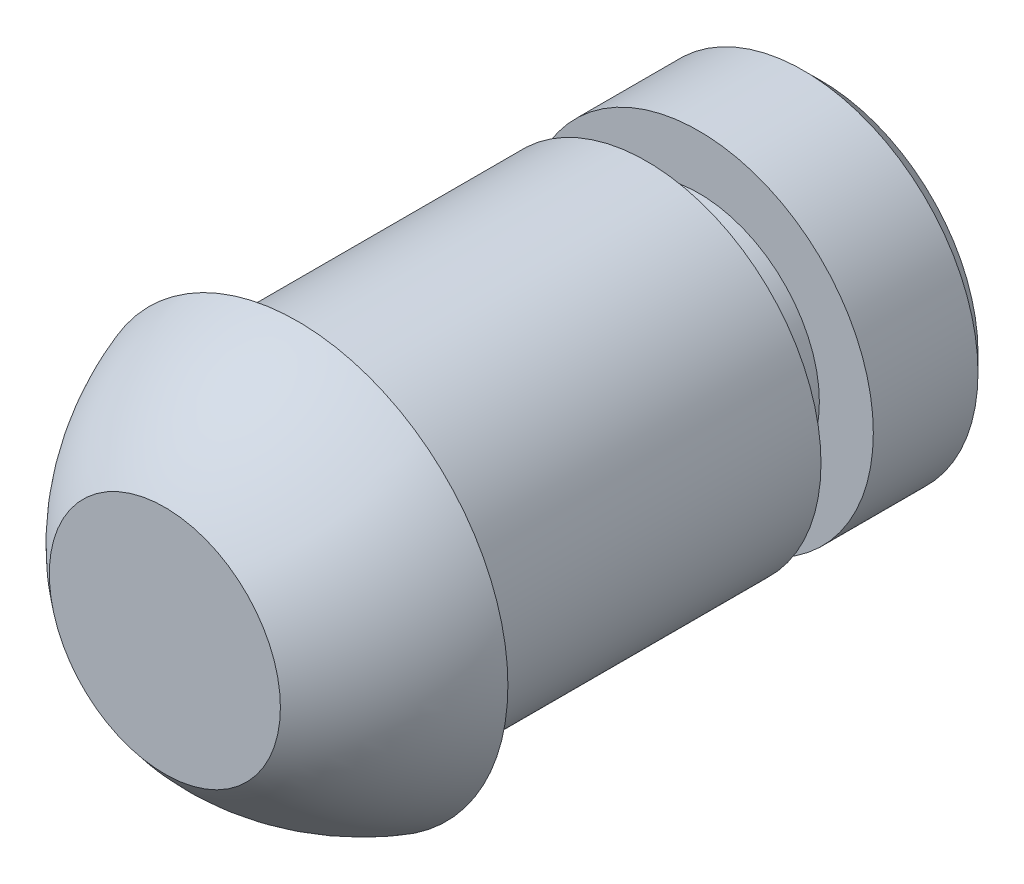
ISO-10303-21;
HEADER;
FILE_DESCRIPTION(('STEP AP214'),'2;1');
FILE_NAME('part.step','',(''),(''),'','','');
FILE_SCHEMA(('AUTOMOTIVE_DESIGN { 1 0 10303 214 1 1 1 1 }'));
ENDSEC;
DATA;
#1=APPLICATION_CONTEXT('core data for automotive mechanical design processes');
#2=APPLICATION_PROTOCOL_DEFINITION('international standard','automotive_design',2000,#1);
#3=PRODUCT_CONTEXT('',#1,'mechanical');
#4=PRODUCT('Part','Part','',(#3));
#5=PRODUCT_RELATED_PRODUCT_CATEGORY('part','',(#4));
#6=PRODUCT_DEFINITION_FORMATION('','',#4);
#7=PRODUCT_DEFINITION_CONTEXT('part definition',#1,'design');
#8=PRODUCT_DEFINITION('design','',#6,#7);
#9=PRODUCT_DEFINITION_SHAPE('','',#8);
#10=(LENGTH_UNIT() NAMED_UNIT(*) SI_UNIT(.MILLI.,.METRE.));
#11=(NAMED_UNIT(*) PLANE_ANGLE_UNIT() SI_UNIT($,.RADIAN.));
#12=(NAMED_UNIT(*) SI_UNIT($,.STERADIAN.) SOLID_ANGLE_UNIT());
#13=UNCERTAINTY_MEASURE_WITH_UNIT(LENGTH_MEASURE(1.E-05),#10,'distance_accuracy_value','');
#14=(GEOMETRIC_REPRESENTATION_CONTEXT(3) GLOBAL_UNCERTAINTY_ASSIGNED_CONTEXT((#13)) GLOBAL_UNIT_ASSIGNED_CONTEXT((#10,
#11,#12)) REPRESENTATION_CONTEXT('',''));
#15=CARTESIAN_POINT('',(0.,0.,0.));
#16=DIRECTION('',(0.,0.,1.));
#17=DIRECTION('',(1.,0.,0.));
#18=AXIS2_PLACEMENT_3D('',#15,#16,#17);
#19=CARTESIAN_POINT('',(0.,1.325,3.36860556627752));
#20=DIRECTION('',(0.,0.,-1.));
#21=DIRECTION('',(-1.,0.,0.));
#22=AXIS2_PLACEMENT_3D('',#19,#20,#21);
#23=PLANE('',#22);
#24=CARTESIAN_POINT('',(0.,0.,3.36860556627752));
#25=DIRECTION('',(0.,0.,1.));
#26=DIRECTION('',(1.,0.,0.));
#27=AXIS2_PLACEMENT_3D('',#24,#25,#26);
#28=CIRCLE('',#27,1.325);
#29=CARTESIAN_POINT('',(1.325,0.,3.36860556627752));
#30=VERTEX_POINT('',#29);
#31=EDGE_CURVE('E70',#30,#30,#28,.T.);
#32=ORIENTED_EDGE('',*,*,#31,.T.);
#33=EDGE_LOOP('',(#32));
#34=FACE_BOUND('',#33,.T.);
#35=ADVANCED_FACE('F37',(#34),#23,.F.);
#36=CARTESIAN_POINT('',(0.,2.,-4.15432123497602));
#37=DIRECTION('',(0.,0.,1.));
#38=DIRECTION('',(1.,0.,0.));
#39=AXIS2_PLACEMENT_3D('',#36,#37,#38);
#40=PLANE('',#39);
#41=CARTESIAN_POINT('',(0.,0.,-4.15432123497602));
#42=DIRECTION('',(0.,0.,1.));
#43=DIRECTION('',(1.,0.,0.));
#44=AXIS2_PLACEMENT_3D('',#41,#42,#43);
#45=CIRCLE('',#44,1.8);
#46=CARTESIAN_POINT('',(1.8,0.,-4.15432123497602));
#47=VERTEX_POINT('',#46);
#48=EDGE_CURVE('E10',#47,#47,#45,.F.);
#49=ORIENTED_EDGE('',*,*,#48,.T.);
#50=EDGE_LOOP('',(#49));
#51=FACE_BOUND('',#50,.T.);
#52=ADVANCED_FACE('F113',(#51),#40,.F.);
#53=CARTESIAN_POINT('',(0.,0.,1.80638464976622));
#54=DIRECTION('',(0.,0.,1.));
#55=DIRECTION('',(1.,0.,0.));
#56=AXIS2_PLACEMENT_3D('',#53,#54,#55);
#57=CYLINDRICAL_SURFACE('',#56,2.);
#58=CARTESIAN_POINT('',(0.,0.,-3.95432123497601));
#59=DIRECTION('',(0.,0.,1.));
#60=DIRECTION('',(1.,0.,0.));
#61=AXIS2_PLACEMENT_3D('',#58,#59,#60);
#62=CIRCLE('',#61,2.);
#63=CARTESIAN_POINT('',(2.,0.,-3.95432123497601));
#64=VERTEX_POINT('',#63);
#65=EDGE_CURVE('E45',#64,#64,#62,.T.);
#66=ORIENTED_EDGE('',*,*,#65,.T.);
#67=EDGE_LOOP('',(#66));
#68=FACE_BOUND('',#67,.T.);
#69=CARTESIAN_POINT('',(0.,0.,-2.75432123497601));
#70=DIRECTION('',(0.,0.,1.));
#71=DIRECTION('',(1.,0.,0.));
#72=AXIS2_PLACEMENT_3D('',#69,#70,#71);
#73=CIRCLE('',#72,2.);
#74=CARTESIAN_POINT('',(2.,0.,-2.75432123497601));
#75=VERTEX_POINT('',#74);
#76=EDGE_CURVE('E49',#75,#75,#73,.T.);
#77=ORIENTED_EDGE('',*,*,#76,.F.);
#78=EDGE_LOOP('',(#77));
#79=FACE_BOUND('',#78,.T.);
#80=ADVANCED_FACE('F108',(#68,#79),#57,.T.);
#81=CARTESIAN_POINT('',(0.,1.38144329896907,-2.75432123497601));
#82=DIRECTION('',(0.,0.,-1.));
#83=DIRECTION('',(-1.,0.,0.));
#84=AXIS2_PLACEMENT_3D('',#81,#82,#83);
#85=PLANE('',#84);
#86=CARTESIAN_POINT('',(0.,0.,-2.75432123497601));
#87=DIRECTION('',(0.,0.,1.));
#88=DIRECTION('',(1.,0.,0.));
#89=AXIS2_PLACEMENT_3D('',#86,#87,#88);
#90=CIRCLE('',#89,1.38144329896907);
#91=CARTESIAN_POINT('',(1.38144329896907,0.,-2.75432123497601));
#92=VERTEX_POINT('',#91);
#93=EDGE_CURVE('E53',#92,#92,#90,.T.);
#94=ORIENTED_EDGE('',*,*,#93,.F.);
#95=EDGE_LOOP('',(#94));
#96=FACE_BOUND('',#95,.T.);
#97=ORIENTED_EDGE('',*,*,#76,.T.);
#98=EDGE_LOOP('',(#97));
#99=FACE_BOUND('',#98,.T.);
#100=ADVANCED_FACE('F102',(#96,#99),#85,.F.);
#101=CARTESIAN_POINT('',(0.,0.,1.80638464976622));
#102=DIRECTION('',(0.,0.,1.));
#103=DIRECTION('',(1.,0.,0.));
#104=AXIS2_PLACEMENT_3D('',#101,#102,#103);
#105=CYLINDRICAL_SURFACE('',#104,1.38144329896907);
#106=CARTESIAN_POINT('',(0.,0.,-2.15432123497602));
#107=DIRECTION('',(0.,0.,1.));
#108=DIRECTION('',(1.,0.,0.));
#109=AXIS2_PLACEMENT_3D('',#106,#107,#108);
#110=CIRCLE('',#109,1.38144329896907);
#111=CARTESIAN_POINT('',(1.38144329896907,0.,-2.15432123497602));
#112=VERTEX_POINT('',#111);
#113=EDGE_CURVE('E58',#112,#112,#110,.T.);
#114=ORIENTED_EDGE('',*,*,#113,.F.);
#115=EDGE_LOOP('',(#114));
#116=FACE_BOUND('',#115,.T.);
#117=ORIENTED_EDGE('',*,*,#93,.T.);
#118=EDGE_LOOP('',(#117));
#119=FACE_BOUND('',#118,.T.);
#120=ADVANCED_FACE('F96',(#116,#119),#105,.T.);
#121=CARTESIAN_POINT('',(0.,2.,-2.15432123497602));
#122=DIRECTION('',(0.,0.,1.));
#123=DIRECTION('',(1.,0.,0.));
#124=AXIS2_PLACEMENT_3D('',#121,#122,#123);
#125=PLANE('',#124);
#126=CARTESIAN_POINT('',(0.,0.,-2.15432123497602));
#127=DIRECTION('',(0.,0.,1.));
#128=DIRECTION('',(1.,0.,0.));
#129=AXIS2_PLACEMENT_3D('',#126,#127,#128);
#130=CIRCLE('',#129,2.);
#131=CARTESIAN_POINT('',(2.,0.,-2.15432123497602));
#132=VERTEX_POINT('',#131);
#133=EDGE_CURVE('E61',#132,#132,#130,.T.);
#134=ORIENTED_EDGE('',*,*,#133,.F.);
#135=EDGE_LOOP('',(#134));
#136=FACE_BOUND('',#135,.T.);
#137=ORIENTED_EDGE('',*,*,#113,.T.);
#138=EDGE_LOOP('',(#137));
#139=FACE_BOUND('',#138,.T.);
#140=ADVANCED_FACE('F90',(#136,#139),#125,.F.);
#141=CARTESIAN_POINT('',(0.,0.,1.80638464976622));
#142=DIRECTION('',(0.,0.,1.));
#143=DIRECTION('',(1.,0.,0.));
#144=AXIS2_PLACEMENT_3D('',#141,#142,#143);
#145=CYLINDRICAL_SURFACE('',#144,2.);
#146=CARTESIAN_POINT('',(0.,0.,1.84567876502398));
#147=DIRECTION('',(0.,0.,1.));
#148=DIRECTION('',(1.,0.,0.));
#149=AXIS2_PLACEMENT_3D('',#146,#147,#148);
#150=CIRCLE('',#149,2.);
#151=CARTESIAN_POINT('',(2.,0.,1.84567876502398));
#152=VERTEX_POINT('',#151);
#153=EDGE_CURVE('E64',#152,#152,#150,.T.);
#154=ORIENTED_EDGE('',*,*,#153,.F.);
#155=EDGE_LOOP('',(#154));
#156=FACE_BOUND('',#155,.T.);
#157=ORIENTED_EDGE('',*,*,#133,.T.);
#158=EDGE_LOOP('',(#157));
#159=FACE_BOUND('',#158,.T.);
#160=ADVANCED_FACE('F84',(#156,#159),#145,.T.);
#161=CARTESIAN_POINT('',(0.,2.,1.84567876502398));
#162=DIRECTION('',(0.,0.,1.));
#163=DIRECTION('',(1.,0.,0.));
#164=AXIS2_PLACEMENT_3D('',#161,#162,#163);
#165=PLANE('',#164);
#166=CARTESIAN_POINT('',(0.,0.,1.84567876502398));
#167=DIRECTION('',(0.,0.,1.));
#168=DIRECTION('',(1.,0.,0.));
#169=AXIS2_PLACEMENT_3D('',#166,#167,#168);
#170=CIRCLE('',#169,2.41023403611573);
#171=CARTESIAN_POINT('',(2.41023403611573,0.,1.84567876502398));
#172=VERTEX_POINT('',#171);
#173=EDGE_CURVE('E67',#172,#172,#170,.T.);
#174=ORIENTED_EDGE('',*,*,#173,.F.);
#175=EDGE_LOOP('',(#174));
#176=FACE_BOUND('',#175,.T.);
#177=ORIENTED_EDGE('',*,*,#153,.T.);
#178=EDGE_LOOP('',(#177));
#179=FACE_BOUND('',#178,.T.);
#180=ADVANCED_FACE('F78',(#176,#179),#165,.F.);
#181=CARTESIAN_POINT('',(0.,0.,0.825544634390364));
#182=DIRECTION('',(0.,0.,1.));
#183=DIRECTION('',(1.,0.,0.));
#184=AXIS2_PLACEMENT_3D('',#181,#182,#183);
#185=DEGENERATE_TOROIDAL_SURFACE('',#184,0.632528147969924,3.20921724932815,.F.);
#186=ORIENTED_EDGE('',*,*,#31,.F.);
#187=EDGE_LOOP('',(#186));
#188=FACE_BOUND('',#187,.T.);
#189=ORIENTED_EDGE('',*,*,#173,.T.);
#190=EDGE_LOOP('',(#189));
#191=FACE_BOUND('',#190,.T.);
#192=ADVANCED_FACE('F75',(#188,#191),#185,.F.);
#193=CARTESIAN_POINT('',(0.,0.,-3.95432123497601));
#194=DIRECTION('',(0.,0.,1.));
#195=DIRECTION('',(1.,0.,0.));
#196=AXIS2_PLACEMENT_3D('',#193,#194,#195);
#197=CONICAL_SURFACE('',#196,2.,0.785398163397453);
#198=ORIENTED_EDGE('',*,*,#48,.F.);
#199=EDGE_LOOP('',(#198));
#200=FACE_BOUND('',#199,.T.);
#201=ORIENTED_EDGE('',*,*,#65,.F.);
#202=EDGE_LOOP('',(#201));
#203=FACE_BOUND('',#202,.T.);
#204=ADVANCED_FACE('F40',(#200,#203),#197,.T.);
#205=CLOSED_SHELL('',(#35,#52,#80,#100,#120,#140,#160,#180,#192,#204));
#206=MANIFOLD_SOLID_BREP('B2',#205);
#207=ADVANCED_BREP_SHAPE_REPRESENTATION('',(#18,#206),#14);
#208=SHAPE_DEFINITION_REPRESENTATION(#9,#207);
ENDSEC;
END-ISO-10303-21;
